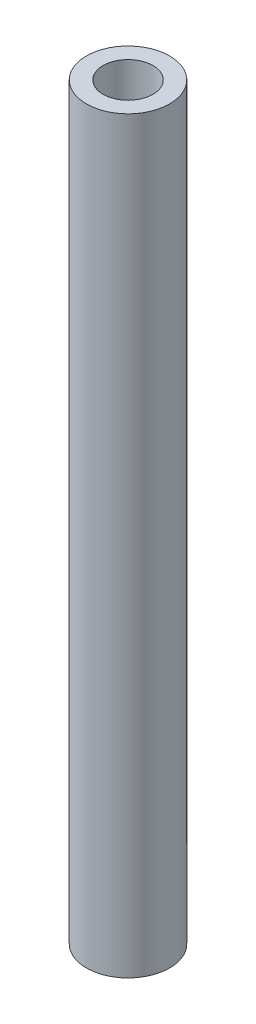
ISO-10303-21;
HEADER;
FILE_DESCRIPTION(('STEP AP214'),'2;1');
FILE_NAME('part.step','',(''),(''),'','','');
FILE_SCHEMA(('AUTOMOTIVE_DESIGN { 1 0 10303 214 1 1 1 1 }'));
ENDSEC;
DATA;
#1=APPLICATION_CONTEXT('core data for automotive mechanical design processes');
#2=APPLICATION_PROTOCOL_DEFINITION('international standard','automotive_design',2000,#1);
#3=PRODUCT_CONTEXT('',#1,'mechanical');
#4=PRODUCT('Part','Part','',(#3));
#5=PRODUCT_RELATED_PRODUCT_CATEGORY('part','',(#4));
#6=PRODUCT_DEFINITION_FORMATION('','',#4);
#7=PRODUCT_DEFINITION_CONTEXT('part definition',#1,'design');
#8=PRODUCT_DEFINITION('design','',#6,#7);
#9=PRODUCT_DEFINITION_SHAPE('','',#8);
#10=(LENGTH_UNIT() NAMED_UNIT(*) SI_UNIT(.MILLI.,.METRE.));
#11=(NAMED_UNIT(*) PLANE_ANGLE_UNIT() SI_UNIT($,.RADIAN.));
#12=(NAMED_UNIT(*) SI_UNIT($,.STERADIAN.) SOLID_ANGLE_UNIT());
#13=UNCERTAINTY_MEASURE_WITH_UNIT(LENGTH_MEASURE(1.E-05),#10,'distance_accuracy_value','');
#14=(GEOMETRIC_REPRESENTATION_CONTEXT(3) GLOBAL_UNCERTAINTY_ASSIGNED_CONTEXT((#13)) GLOBAL_UNIT_ASSIGNED_CONTEXT((#10,
#11,#12)) REPRESENTATION_CONTEXT('',''));
#15=CARTESIAN_POINT('',(0.,0.,0.));
#16=DIRECTION('',(0.,0.,1.));
#17=DIRECTION('',(1.,0.,0.));
#18=AXIS2_PLACEMENT_3D('',#15,#16,#17);
#19=CARTESIAN_POINT('',(0.,45.,0.));
#20=DIRECTION('',(0.,1.,0.));
#21=DIRECTION('',(0.,0.,1.));
#22=AXIS2_PLACEMENT_3D('',#19,#20,#21);
#23=PLANE('',#22);
#24=CARTESIAN_POINT('',(0.,45.,0.));
#25=DIRECTION('',(0.,1.,0.));
#26=DIRECTION('',(0.,0.,1.));
#27=AXIS2_PLACEMENT_3D('',#24,#25,#26);
#28=CIRCLE('',#27,2.5);
#29=CARTESIAN_POINT('',(0.,45.,-2.5));
#30=VERTEX_POINT('',#29);
#31=EDGE_CURVE('E10',#30,#30,#28,.T.);
#32=ORIENTED_EDGE('',*,*,#31,.T.);
#33=EDGE_LOOP('',(#32));
#34=FACE_BOUND('',#33,.T.);
#35=CARTESIAN_POINT('',(0.,45.,0.));
#36=DIRECTION('',(0.,1.,0.));
#37=DIRECTION('',(0.,0.,1.));
#38=AXIS2_PLACEMENT_3D('',#35,#36,#37);
#39=CIRCLE('',#38,1.5);
#40=CARTESIAN_POINT('',(0.,45.,-1.5));
#41=VERTEX_POINT('',#40);
#42=EDGE_CURVE('E56',#41,#41,#39,.T.);
#43=ORIENTED_EDGE('',*,*,#42,.F.);
#44=EDGE_LOOP('',(#43));
#45=FACE_BOUND('',#44,.T.);
#46=ADVANCED_FACE('F43',(#34,#45),#23,.T.);
#47=CARTESIAN_POINT('',(0.,0.,0.));
#48=DIRECTION('',(0.,1.,0.));
#49=DIRECTION('',(0.,0.,1.));
#50=AXIS2_PLACEMENT_3D('',#47,#48,#49);
#51=PLANE('',#50);
#52=CARTESIAN_POINT('',(0.,0.,0.));
#53=DIRECTION('',(0.,1.,0.));
#54=DIRECTION('',(0.,0.,1.));
#55=AXIS2_PLACEMENT_3D('',#52,#53,#54);
#56=CIRCLE('',#55,2.5);
#57=CARTESIAN_POINT('',(0.,0.,-2.5));
#58=VERTEX_POINT('',#57);
#59=EDGE_CURVE('E47',#58,#58,#56,.T.);
#60=ORIENTED_EDGE('',*,*,#59,.F.);
#61=EDGE_LOOP('',(#60));
#62=FACE_BOUND('',#61,.T.);
#63=CARTESIAN_POINT('',(0.,0.,0.));
#64=DIRECTION('',(0.,1.,0.));
#65=DIRECTION('',(0.,0.,1.));
#66=AXIS2_PLACEMENT_3D('',#63,#64,#65);
#67=CIRCLE('',#66,1.5);
#68=CARTESIAN_POINT('',(0.,0.,-1.5));
#69=VERTEX_POINT('',#68);
#70=EDGE_CURVE('E58',#69,#69,#67,.T.);
#71=ORIENTED_EDGE('',*,*,#70,.T.);
#72=EDGE_LOOP('',(#71));
#73=FACE_BOUND('',#72,.T.);
#74=ADVANCED_FACE('F70',(#62,#73),#51,.F.);
#75=CARTESIAN_POINT('',(0.,45.,0.));
#76=DIRECTION('',(0.,-1.,0.));
#77=DIRECTION('',(0.,0.,-1.));
#78=AXIS2_PLACEMENT_3D('',#75,#76,#77);
#79=CYLINDRICAL_SURFACE('',#78,2.5);
#80=CARTESIAN_POINT('',(0.,45.,-2.5));
#81=CARTESIAN_POINT('',(0.,44.53125,-2.5));
#82=CARTESIAN_POINT('',(0.,44.0625,-2.5));
#83=CARTESIAN_POINT('',(0.,43.125,-2.5));
#84=CARTESIAN_POINT('',(0.,42.65625,-2.5));
#85=CARTESIAN_POINT('',(0.,41.71875,-2.5));
#86=CARTESIAN_POINT('',(0.,41.25,-2.5));
#87=CARTESIAN_POINT('',(0.,40.3125,-2.5));
#88=CARTESIAN_POINT('',(0.,39.84375,-2.5));
#89=CARTESIAN_POINT('',(0.,38.90625,-2.5));
#90=CARTESIAN_POINT('',(0.,38.4375,-2.5));
#91=CARTESIAN_POINT('',(0.,37.5,-2.5));
#92=CARTESIAN_POINT('',(0.,37.03125,-2.5));
#93=CARTESIAN_POINT('',(0.,36.09375,-2.5));
#94=CARTESIAN_POINT('',(0.,35.625,-2.5));
#95=CARTESIAN_POINT('',(0.,34.6875,-2.5));
#96=CARTESIAN_POINT('',(0.,34.21875,-2.5));
#97=CARTESIAN_POINT('',(0.,33.28125,-2.5));
#98=CARTESIAN_POINT('',(0.,32.8125,-2.5));
#99=CARTESIAN_POINT('',(0.,31.875,-2.5));
#100=CARTESIAN_POINT('',(0.,31.40625,-2.5));
#101=CARTESIAN_POINT('',(0.,30.46875,-2.5));
#102=CARTESIAN_POINT('',(0.,30.,-2.5));
#103=CARTESIAN_POINT('',(0.,29.0625,-2.5));
#104=CARTESIAN_POINT('',(0.,28.59375,-2.5));
#105=CARTESIAN_POINT('',(0.,27.65625,-2.5));
#106=CARTESIAN_POINT('',(0.,27.1875,-2.5));
#107=CARTESIAN_POINT('',(0.,26.25,-2.5));
#108=CARTESIAN_POINT('',(0.,25.78125,-2.5));
#109=CARTESIAN_POINT('',(0.,24.84375,-2.5));
#110=CARTESIAN_POINT('',(0.,24.375,-2.5));
#111=CARTESIAN_POINT('',(0.,23.4375,-2.5));
#112=CARTESIAN_POINT('',(0.,22.96875,-2.5));
#113=CARTESIAN_POINT('',(0.,22.03125,-2.5));
#114=CARTESIAN_POINT('',(0.,21.5625,-2.5));
#115=CARTESIAN_POINT('',(0.,20.625,-2.5));
#116=CARTESIAN_POINT('',(0.,20.15625,-2.5));
#117=CARTESIAN_POINT('',(0.,19.21875,-2.5));
#118=CARTESIAN_POINT('',(0.,18.75,-2.5));
#119=CARTESIAN_POINT('',(0.,17.8125,-2.5));
#120=CARTESIAN_POINT('',(0.,17.34375,-2.5));
#121=CARTESIAN_POINT('',(0.,16.40625,-2.5));
#122=CARTESIAN_POINT('',(0.,15.9375,-2.5));
#123=CARTESIAN_POINT('',(0.,15.,-2.5));
#124=CARTESIAN_POINT('',(0.,14.53125,-2.5));
#125=CARTESIAN_POINT('',(0.,13.59375,-2.5));
#126=CARTESIAN_POINT('',(0.,13.125,-2.5));
#127=CARTESIAN_POINT('',(0.,12.1875,-2.5));
#128=CARTESIAN_POINT('',(0.,11.71875,-2.5));
#129=CARTESIAN_POINT('',(0.,10.78125,-2.5));
#130=CARTESIAN_POINT('',(0.,10.3125,-2.5));
#131=CARTESIAN_POINT('',(0.,9.37499999999999,-2.5));
#132=CARTESIAN_POINT('',(0.,8.90624999999999,-2.5));
#133=CARTESIAN_POINT('',(0.,7.96874999999999,-2.5));
#134=CARTESIAN_POINT('',(0.,7.5,-2.5));
#135=CARTESIAN_POINT('',(0.,6.56249999999999,-2.5));
#136=CARTESIAN_POINT('',(0.,6.09374999999999,-2.5));
#137=CARTESIAN_POINT('',(0.,5.15624999999999,-2.5));
#138=CARTESIAN_POINT('',(0.,4.68749999999999,-2.5));
#139=CARTESIAN_POINT('',(0.,3.74999999999999,-2.5));
#140=CARTESIAN_POINT('',(0.,3.28124999999999,-2.5));
#141=CARTESIAN_POINT('',(0.,2.34374999999999,-2.5));
#142=CARTESIAN_POINT('',(0.,1.87499999999999,-2.5));
#143=CARTESIAN_POINT('',(0.,0.937499999999992,-2.5));
#144=CARTESIAN_POINT('',(0.,0.468749999999993,-2.5));
#145=CARTESIAN_POINT('',(0.,0.,-2.5));
#146=B_SPLINE_CURVE_WITH_KNOTS('',3,(#80,#81,#82,#83,#84,#85,#86,#87,#88,#89,#90,#91,#92,#93,
#94,#95,#96,#97,#98,#99,#100,#101,#102,#103,#104,#105,#106,#107,#108,#109,#110,#111,#112,#113,
#114,#115,#116,#117,#118,#119,#120,#121,#122,#123,#124,#125,#126,#127,#128,#129,#130,#131,#132,
#133,#134,#135,#136,#137,#138,#139,#140,#141,#142,#143,#144,#145),.UNSPECIFIED.,.F.,.F.,(4,2,2,
2,2,2,2,2,2,2,2,2,2,2,2,2,2,2,2,2,2,2,2,2,2,2,2,2,2,2,2,2,4),(0.,1.40625,2.8125,
4.21874999999999,5.625,7.03125,8.43749999999999,9.84375,11.25,12.65625,14.0625,15.46875,16.875,
18.28125,19.6875,21.09375,22.5,23.90625,25.3125,26.71875,28.125,29.53125,30.9375,32.34375,33.75,
35.15625,36.5625,37.96875,39.375,40.78125,42.1875,43.59375,45.),.UNSPECIFIED.);
#147=EDGE_CURVE('BSEAM45',#30,#58,#146,.T.);
#148=ORIENTED_EDGE('',*,*,#31,.F.);
#149=ORIENTED_EDGE('',*,*,#59,.T.);
#150=ORIENTED_EDGE('',*,*,#147,.T.);
#151=ORIENTED_EDGE('',*,*,#147,.F.);
#152=EDGE_LOOP('',(#148,#150,#149,#151));
#153=FACE_BOUND('',#152,.T.);
#154=ADVANCED_FACE('F45',(#153),#79,.T.);
#155=CARTESIAN_POINT('',(0.,45.,0.));
#156=DIRECTION('',(0.,-1.,0.));
#157=DIRECTION('',(0.,0.,-1.));
#158=AXIS2_PLACEMENT_3D('',#155,#156,#157);
#159=CYLINDRICAL_SURFACE('',#158,1.5);
#160=CARTESIAN_POINT('',(0.,45.,-1.5));
#161=CARTESIAN_POINT('',(0.,44.53125,-1.5));
#162=CARTESIAN_POINT('',(0.,44.0625,-1.5));
#163=CARTESIAN_POINT('',(0.,43.125,-1.5));
#164=CARTESIAN_POINT('',(0.,42.65625,-1.5));
#165=CARTESIAN_POINT('',(0.,41.71875,-1.5));
#166=CARTESIAN_POINT('',(0.,41.25,-1.5));
#167=CARTESIAN_POINT('',(0.,40.3125,-1.5));
#168=CARTESIAN_POINT('',(0.,39.84375,-1.5));
#169=CARTESIAN_POINT('',(0.,38.90625,-1.5));
#170=CARTESIAN_POINT('',(0.,38.4375,-1.5));
#171=CARTESIAN_POINT('',(0.,37.5,-1.5));
#172=CARTESIAN_POINT('',(0.,37.03125,-1.5));
#173=CARTESIAN_POINT('',(0.,36.09375,-1.5));
#174=CARTESIAN_POINT('',(0.,35.625,-1.5));
#175=CARTESIAN_POINT('',(0.,34.6875,-1.5));
#176=CARTESIAN_POINT('',(0.,34.21875,-1.5));
#177=CARTESIAN_POINT('',(0.,33.28125,-1.5));
#178=CARTESIAN_POINT('',(0.,32.8125,-1.5));
#179=CARTESIAN_POINT('',(0.,31.875,-1.5));
#180=CARTESIAN_POINT('',(0.,31.40625,-1.5));
#181=CARTESIAN_POINT('',(0.,30.46875,-1.5));
#182=CARTESIAN_POINT('',(0.,30.,-1.5));
#183=CARTESIAN_POINT('',(0.,29.0625,-1.5));
#184=CARTESIAN_POINT('',(0.,28.59375,-1.5));
#185=CARTESIAN_POINT('',(0.,27.65625,-1.5));
#186=CARTESIAN_POINT('',(0.,27.1875,-1.5));
#187=CARTESIAN_POINT('',(0.,26.25,-1.5));
#188=CARTESIAN_POINT('',(0.,25.78125,-1.5));
#189=CARTESIAN_POINT('',(0.,24.84375,-1.5));
#190=CARTESIAN_POINT('',(0.,24.375,-1.5));
#191=CARTESIAN_POINT('',(0.,23.4375,-1.5));
#192=CARTESIAN_POINT('',(0.,22.96875,-1.5));
#193=CARTESIAN_POINT('',(0.,22.03125,-1.5));
#194=CARTESIAN_POINT('',(0.,21.5625,-1.5));
#195=CARTESIAN_POINT('',(0.,20.625,-1.5));
#196=CARTESIAN_POINT('',(0.,20.15625,-1.5));
#197=CARTESIAN_POINT('',(0.,19.21875,-1.5));
#198=CARTESIAN_POINT('',(0.,18.75,-1.5));
#199=CARTESIAN_POINT('',(0.,17.8125,-1.5));
#200=CARTESIAN_POINT('',(0.,17.34375,-1.5));
#201=CARTESIAN_POINT('',(0.,16.40625,-1.5));
#202=CARTESIAN_POINT('',(0.,15.9375,-1.5));
#203=CARTESIAN_POINT('',(0.,15.,-1.5));
#204=CARTESIAN_POINT('',(0.,14.53125,-1.5));
#205=CARTESIAN_POINT('',(0.,13.59375,-1.5));
#206=CARTESIAN_POINT('',(0.,13.125,-1.5));
#207=CARTESIAN_POINT('',(0.,12.1875,-1.5));
#208=CARTESIAN_POINT('',(0.,11.71875,-1.5));
#209=CARTESIAN_POINT('',(0.,10.78125,-1.5));
#210=CARTESIAN_POINT('',(0.,10.3125,-1.5));
#211=CARTESIAN_POINT('',(0.,9.37499999999999,-1.5));
#212=CARTESIAN_POINT('',(0.,8.90624999999999,-1.5));
#213=CARTESIAN_POINT('',(0.,7.96874999999999,-1.5));
#214=CARTESIAN_POINT('',(0.,7.5,-1.5));
#215=CARTESIAN_POINT('',(0.,6.56249999999999,-1.5));
#216=CARTESIAN_POINT('',(0.,6.09374999999999,-1.5));
#217=CARTESIAN_POINT('',(0.,5.15624999999999,-1.5));
#218=CARTESIAN_POINT('',(0.,4.68749999999999,-1.5));
#219=CARTESIAN_POINT('',(0.,3.74999999999999,-1.5));
#220=CARTESIAN_POINT('',(0.,3.28124999999999,-1.5));
#221=CARTESIAN_POINT('',(0.,2.34374999999999,-1.5));
#222=CARTESIAN_POINT('',(0.,1.87499999999999,-1.5));
#223=CARTESIAN_POINT('',(0.,0.937499999999992,-1.5));
#224=CARTESIAN_POINT('',(0.,0.468749999999993,-1.5));
#225=CARTESIAN_POINT('',(0.,0.,-1.5));
#226=B_SPLINE_CURVE_WITH_KNOTS('',3,(#160,#161,#162,#163,#164,#165,#166,#167,#168,#169,#170,
#171,#172,#173,#174,#175,#176,#177,#178,#179,#180,#181,#182,#183,#184,#185,#186,#187,#188,#189,
#190,#191,#192,#193,#194,#195,#196,#197,#198,#199,#200,#201,#202,#203,#204,#205,#206,#207,#208,
#209,#210,#211,#212,#213,#214,#215,#216,#217,#218,#219,#220,#221,#222,#223,#224,#225),
.UNSPECIFIED.,.F.,.F.,(4,2,2,2,2,2,2,2,2,2,2,2,2,2,2,2,2,2,2,2,2,2,2,2,2,2,2,2,2,2,2,2,4),(0.,
1.40625,2.8125,4.21874999999999,5.625,7.03125,8.43749999999999,9.84375,11.25,12.65625,14.0625,
15.46875,16.875,18.28125,19.6875,21.09375,22.5,23.90625,25.3125,26.71875,28.125,29.53125,
30.9375,32.34375,33.75,35.15625,36.5625,37.96875,39.375,40.78125,42.1875,43.59375,45.),.UNSPECIFIED.);
#227=EDGE_CURVE('BSEAM66',#41,#69,#226,.T.);
#228=ORIENTED_EDGE('',*,*,#42,.T.);
#229=ORIENTED_EDGE('',*,*,#70,.F.);
#230=ORIENTED_EDGE('',*,*,#227,.T.);
#231=ORIENTED_EDGE('',*,*,#227,.F.);
#232=EDGE_LOOP('',(#228,#230,#229,#231));
#233=FACE_BOUND('',#232,.T.);
#234=ADVANCED_FACE('F66',(#233),#159,.F.);
#235=CLOSED_SHELL('',(#46,#74,#154,#234));
#236=MANIFOLD_SOLID_BREP('B2',#235);
#237=ADVANCED_BREP_SHAPE_REPRESENTATION('',(#18,#236),#14);
#238=SHAPE_DEFINITION_REPRESENTATION(#9,#237);
ENDSEC;
END-ISO-10303-21;
